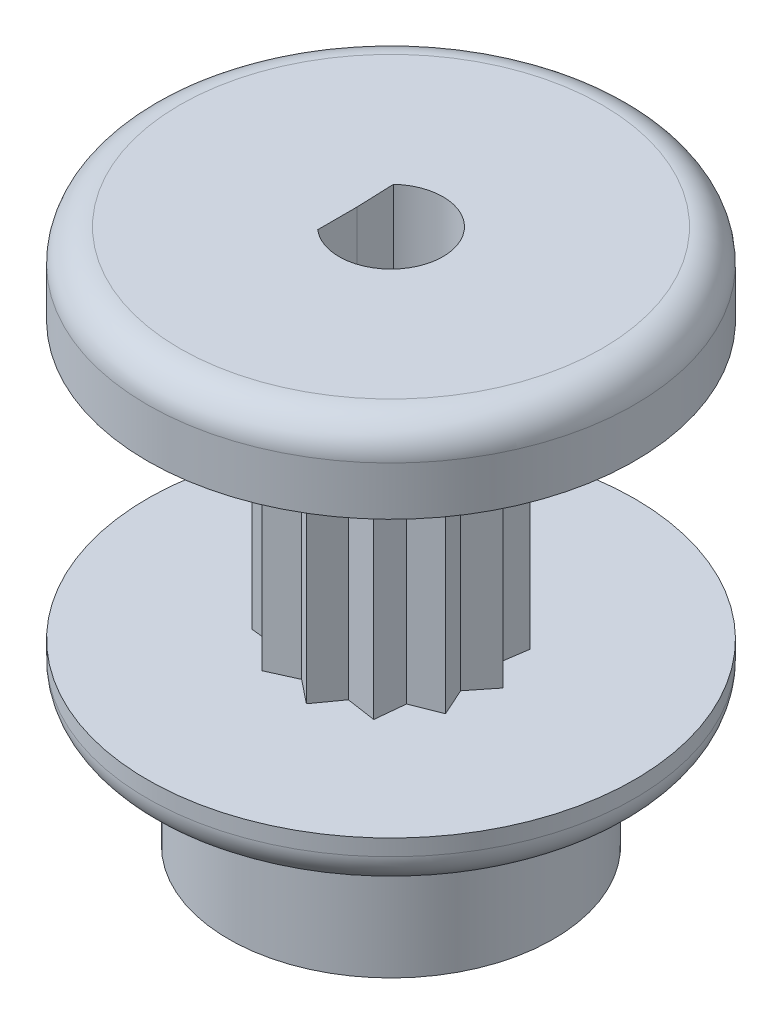
ISO-10303-21;
HEADER;
FILE_DESCRIPTION(('STEP AP214'),'2;1');
FILE_NAME('part.step','',(''),(''),'','','');
FILE_SCHEMA(('AUTOMOTIVE_DESIGN { 1 0 10303 214 1 1 1 1 }'));
ENDSEC;
DATA;
#1=APPLICATION_CONTEXT('core data for automotive mechanical design processes');
#2=APPLICATION_PROTOCOL_DEFINITION('international standard','automotive_design',2000,#1);
#3=PRODUCT_CONTEXT('',#1,'mechanical');
#4=PRODUCT('Part','Part','',(#3));
#5=PRODUCT_RELATED_PRODUCT_CATEGORY('part','',(#4));
#6=PRODUCT_DEFINITION_FORMATION('','',#4);
#7=PRODUCT_DEFINITION_CONTEXT('part definition',#1,'design');
#8=PRODUCT_DEFINITION('design','',#6,#7);
#9=PRODUCT_DEFINITION_SHAPE('','',#8);
#10=(LENGTH_UNIT() NAMED_UNIT(*) SI_UNIT(.MILLI.,.METRE.));
#11=(NAMED_UNIT(*) PLANE_ANGLE_UNIT() SI_UNIT($,.RADIAN.));
#12=(NAMED_UNIT(*) SI_UNIT($,.STERADIAN.) SOLID_ANGLE_UNIT());
#13=UNCERTAINTY_MEASURE_WITH_UNIT(LENGTH_MEASURE(1.E-05),#10,'distance_accuracy_value','');
#14=(GEOMETRIC_REPRESENTATION_CONTEXT(3) GLOBAL_UNCERTAINTY_ASSIGNED_CONTEXT((#13)) GLOBAL_UNIT_ASSIGNED_CONTEXT((#10,
#11,#12)) REPRESENTATION_CONTEXT('',''));
#15=CARTESIAN_POINT('',(0.,0.,0.));
#16=DIRECTION('',(0.,0.,1.));
#17=DIRECTION('',(1.,0.,0.));
#18=AXIS2_PLACEMENT_3D('',#15,#16,#17);
#19=CARTESIAN_POINT('',(2.40897724298439,8.5,-1.87597459427595));
#20=DIRECTION('',(-0.98910508226612,0.,-0.147211196025749));
#21=DIRECTION('',(-0.147211196025749,0.,0.98910508226612));
#22=AXIS2_PLACEMENT_3D('',#19,#20,#21);
#23=PLANE('',#22);
#24=DIRECTION('',(0.147211196025749,0.,-0.98910508226612));
#25=VECTOR('',#24,1.);
#26=CARTESIAN_POINT('',(2.40897724298439,0.,-1.87597459427595));
#27=LINE('',#26,#25);
#28=CARTESIAN_POINT('',(2.27272108525414,0.,-0.960475897577142));
#29=VERTEX_POINT('',#28);
#30=CARTESIAN_POINT('',(2.40897724298439,0.,-1.87597459427595));
#31=VERTEX_POINT('',#30);
#32=EDGE_CURVE('E259',#29,#31,#27,.T.);
#33=ORIENTED_EDGE('',*,*,#32,.T.);
#34=DIRECTION('',(0.,-1.,0.));
#35=VECTOR('',#34,1.);
#36=CARTESIAN_POINT('',(2.40897724298439,8.5,-1.87597459427595));
#37=LINE('',#36,#35);
#38=CARTESIAN_POINT('',(2.40897724298439,8.5,-1.87597459427595));
#39=VERTEX_POINT('',#38);
#40=EDGE_CURVE('E253',#39,#31,#37,.T.);
#41=ORIENTED_EDGE('',*,*,#40,.F.);
#42=DIRECTION('',(0.147211196025749,0.,-0.98910508226612));
#43=VECTOR('',#42,1.);
#44=CARTESIAN_POINT('',(2.40897724298439,8.5,-1.87597459427595));
#45=LINE('',#44,#43);
#46=CARTESIAN_POINT('',(2.27272108525414,8.5,-0.960475897577142));
#47=VERTEX_POINT('',#46);
#48=EDGE_CURVE('E260',#47,#39,#45,.T.);
#49=ORIENTED_EDGE('',*,*,#48,.F.);
#50=DIRECTION('',(0.,-1.,0.));
#51=VECTOR('',#50,1.);
#52=CARTESIAN_POINT('',(2.27272108525414,8.5,-0.960475897577142));
#53=LINE('',#52,#51);
#54=EDGE_CURVE('E333',#47,#29,#53,.T.);
#55=ORIENTED_EDGE('',*,*,#54,.T.);
#56=EDGE_LOOP('',(#33,#41,#49,#55));
#57=FACE_BOUND('',#56,.T.);
#58=ADVANCED_FACE('F33',(#57),#23,.F.);
#59=CARTESIAN_POINT('',(2.40897724298439,8.5,-1.87597459427595));
#60=DIRECTION('',(-0.0995939756317187,0.,0.995028160414502));
#61=DIRECTION('',(0.995028160414502,0.,0.0995939756317187));
#62=AXIS2_PLACEMENT_3D('',#59,#60,#61);
#63=PLANE('',#62);
#64=DIRECTION('',(-0.995028160414502,0.,-0.0995939756317187));
#65=VECTOR('',#64,1.);
#66=CARTESIAN_POINT('',(2.40897724298439,0.,-1.87597459427595));
#67=LINE('',#66,#65);
#68=CARTESIAN_POINT('',(1.48799624675807,0.,-1.96815706965156));
#69=VERTEX_POINT('',#68);
#70=EDGE_CURVE('E336',#31,#69,#67,.T.);
#71=ORIENTED_EDGE('',*,*,#70,.T.);
#72=DIRECTION('',(0.,-1.,0.));
#73=VECTOR('',#72,1.);
#74=CARTESIAN_POINT('',(1.48799624675807,8.5,-1.96815706965156));
#75=LINE('',#74,#73);
#76=CARTESIAN_POINT('',(1.48799624675807,8.5,-1.96815706965156));
#77=VERTEX_POINT('',#76);
#78=EDGE_CURVE('E469',#77,#69,#75,.T.);
#79=ORIENTED_EDGE('',*,*,#78,.F.);
#80=DIRECTION('',(-0.995028160414502,0.,-0.0995939756317187));
#81=VECTOR('',#80,1.);
#82=CARTESIAN_POINT('',(2.40897724298439,8.5,-1.87597459427595));
#83=LINE('',#82,#81);
#84=EDGE_CURVE('E263',#39,#77,#83,.T.);
#85=ORIENTED_EDGE('',*,*,#84,.F.);
#86=ORIENTED_EDGE('',*,*,#40,.T.);
#87=EDGE_LOOP('',(#71,#79,#85,#86));
#88=FACE_BOUND('',#87,.T.);
#89=ADVANCED_FACE('F494',(#88),#63,.F.);
#90=CARTESIAN_POINT('',(1.14824819242517,8.5,-2.82913027698939));
#91=DIRECTION('',(-0.930195726267649,0.,0.367063905653228));
#92=DIRECTION('',(0.367063905653228,0.,0.930195726267649));
#93=AXIS2_PLACEMENT_3D('',#90,#91,#92);
#94=PLANE('',#93);
#95=DIRECTION('',(-0.367063905653228,0.,-0.930195726267649));
#96=VECTOR('',#95,1.);
#97=CARTESIAN_POINT('',(1.14824819242517,0.,-2.82913027698939));
#98=LINE('',#97,#96);
#99=CARTESIAN_POINT('',(1.14824819242517,0.,-2.82913027698939));
#100=VERTEX_POINT('',#99);
#101=EDGE_CURVE('E339',#69,#100,#98,.T.);
#102=ORIENTED_EDGE('',*,*,#101,.T.);
#103=DIRECTION('',(0.,-1.,0.));
#104=VECTOR('',#103,1.);
#105=CARTESIAN_POINT('',(1.14824819242517,8.5,-2.82913027698939));
#106=LINE('',#105,#104);
#107=CARTESIAN_POINT('',(1.14824819242517,8.5,-2.82913027698939));
#108=VERTEX_POINT('',#107);
#109=EDGE_CURVE('E466',#108,#100,#106,.T.);
#110=ORIENTED_EDGE('',*,*,#109,.F.);
#111=DIRECTION('',(-0.367063905653228,0.,-0.930195726267649));
#112=VECTOR('',#111,1.);
#113=CARTESIAN_POINT('',(1.14824819242517,8.5,-2.82913027698939));
#114=LINE('',#113,#112);
#115=EDGE_CURVE('E267',#77,#108,#114,.T.);
#116=ORIENTED_EDGE('',*,*,#115,.F.);
#117=ORIENTED_EDGE('',*,*,#78,.T.);
#118=EDGE_LOOP('',(#102,#110,#116,#117));
#119=FACE_BOUND('',#118,.T.);
#120=ADVANCED_FACE('F500',(#119),#94,.F.);
#121=CARTESIAN_POINT('',(1.14824819242517,8.5,-2.82913027698939));
#122=DIRECTION('',(0.411263167246308,0.,0.91151665221571));
#123=DIRECTION('',(0.91151665221571,0.,-0.411263167246308));
#124=AXIS2_PLACEMENT_3D('',#121,#122,#123);
#125=PLANE('',#124);
#126=DIRECTION('',(-0.91151665221571,0.,0.411263167246308));
#127=VECTOR('',#126,1.);
#128=CARTESIAN_POINT('',(1.14824819242517,0.,-2.82913027698939));
#129=LINE('',#128,#127);
#130=CARTESIAN_POINT('',(0.304564015602649,0.,-2.44847214433521));
#131=VERTEX_POINT('',#130);
#132=EDGE_CURVE('E342',#100,#131,#129,.T.);
#133=ORIENTED_EDGE('',*,*,#132,.T.);
#134=DIRECTION('',(0.,-1.,0.));
#135=VECTOR('',#134,1.);
#136=CARTESIAN_POINT('',(0.304564015602649,8.5,-2.44847214433521));
#137=LINE('',#136,#135);
#138=CARTESIAN_POINT('',(0.304564015602649,8.5,-2.44847214433521));
#139=VERTEX_POINT('',#138);
#140=EDGE_CURVE('E463',#139,#131,#137,.T.);
#141=ORIENTED_EDGE('',*,*,#140,.F.);
#142=DIRECTION('',(-0.91151665221571,0.,0.411263167246308));
#143=VECTOR('',#142,1.);
#144=CARTESIAN_POINT('',(1.14824819242517,8.5,-2.82913027698939));
#145=LINE('',#144,#143);
#146=EDGE_CURVE('E270',#108,#139,#145,.T.);
#147=ORIENTED_EDGE('',*,*,#146,.F.);
#148=ORIENTED_EDGE('',*,*,#109,.T.);
#149=EDGE_LOOP('',(#133,#141,#147,#148));
#150=FACE_BOUND('',#149,.T.);
#151=ADVANCED_FACE('F506',(#150),#125,.F.);
#152=CARTESIAN_POINT('',(-0.420153034004953,8.5,-3.02422278670106));
#153=DIRECTION('',(-0.622041176612838,0.,0.782984530241892));
#154=DIRECTION('',(0.782984530241892,0.,0.622041176612838));
#155=AXIS2_PLACEMENT_3D('',#152,#153,#154);
#156=PLANE('',#155);
#157=DIRECTION('',(-0.782984530241892,0.,-0.622041176612838));
#158=VECTOR('',#157,1.);
#159=CARTESIAN_POINT('',(-0.420153034004953,0.,-3.02422278670106));
#160=LINE('',#159,#158);
#161=CARTESIAN_POINT('',(-0.420153034004953,0.,-3.02422278670106));
#162=VERTEX_POINT('',#161);
#163=EDGE_CURVE('E345',#131,#162,#160,.T.);
#164=ORIENTED_EDGE('',*,*,#163,.T.);
#165=DIRECTION('',(0.,-1.,0.));
#166=VECTOR('',#165,1.);
#167=CARTESIAN_POINT('',(-0.420153034004953,8.5,-3.02422278670106));
#168=LINE('',#167,#166);
#169=CARTESIAN_POINT('',(-0.420153034004953,8.5,-3.02422278670106));
#170=VERTEX_POINT('',#169);
#171=EDGE_CURVE('E460',#170,#162,#168,.T.);
#172=ORIENTED_EDGE('',*,*,#171,.F.);
#173=DIRECTION('',(-0.782984530241892,0.,-0.622041176612838));
#174=VECTOR('',#173,1.);
#175=CARTESIAN_POINT('',(-0.420153034004953,8.5,-3.02422278670106));
#176=LINE('',#175,#174);
#177=EDGE_CURVE('E273',#139,#170,#176,.T.);
#178=ORIENTED_EDGE('',*,*,#177,.F.);
#179=ORIENTED_EDGE('',*,*,#140,.T.);
#180=EDGE_LOOP('',(#164,#172,#178,#179));
#181=FACE_BOUND('',#180,.T.);
#182=ADVANCED_FACE('F510',(#181),#156,.F.);
#183=CARTESIAN_POINT('',(-0.420153034004953,8.5,-3.02422278670106));
#184=DIRECTION('',(0.811922676584047,0.,0.583764993168138));
#185=DIRECTION('',(0.583764993168138,0.,-0.811922676584047));
#186=AXIS2_PLACEMENT_3D('',#183,#184,#185);
#187=PLANE('',#186);
#188=DIRECTION('',(-0.583764993168138,0.,0.811922676584047));
#189=VECTOR('',#188,1.);
#190=CARTESIAN_POINT('',(-0.420153034004953,0.,-3.02422278670106));
#191=LINE('',#190,#189);
#192=CARTESIAN_POINT('',(-0.960475897577033,0.,-2.27272108525415));
#193=VERTEX_POINT('',#192);
#194=EDGE_CURVE('E348',#162,#193,#191,.T.);
#195=ORIENTED_EDGE('',*,*,#194,.T.);
#196=DIRECTION('',(0.,-1.,0.));
#197=VECTOR('',#196,1.);
#198=CARTESIAN_POINT('',(-0.960475897577033,8.5,-2.27272108525415));
#199=LINE('',#198,#197);
#200=CARTESIAN_POINT('',(-0.960475897577033,8.5,-2.27272108525415));
#201=VERTEX_POINT('',#200);
#202=EDGE_CURVE('E457',#201,#193,#199,.T.);
#203=ORIENTED_EDGE('',*,*,#202,.F.);
#204=DIRECTION('',(-0.583764993168138,0.,0.811922676584047));
#205=VECTOR('',#204,1.);
#206=CARTESIAN_POINT('',(-0.420153034004953,8.5,-3.02422278670106));
#207=LINE('',#206,#205);
#208=EDGE_CURVE('E276',#170,#201,#207,.T.);
#209=ORIENTED_EDGE('',*,*,#208,.F.);
#210=ORIENTED_EDGE('',*,*,#171,.T.);
#211=EDGE_LOOP('',(#195,#203,#209,#210));
#212=FACE_BOUND('',#211,.T.);
#213=ADVANCED_FACE('F514',(#212),#187,.F.);
#214=CARTESIAN_POINT('',(-1.87597459427584,8.5,-2.4089772429844));
#215=DIRECTION('',(-0.147211196025749,0.,0.98910508226612));
#216=DIRECTION('',(0.98910508226612,0.,0.147211196025749));
#217=AXIS2_PLACEMENT_3D('',#214,#215,#216);
#218=PLANE('',#217);
#219=DIRECTION('',(-0.98910508226612,0.,-0.147211196025749));
#220=VECTOR('',#219,1.);
#221=CARTESIAN_POINT('',(-1.87597459427584,0.,-2.4089772429844));
#222=LINE('',#221,#220);
#223=CARTESIAN_POINT('',(-1.87597459427584,0.,-2.4089772429844));
#224=VERTEX_POINT('',#223);
#225=EDGE_CURVE('E351',#193,#224,#222,.T.);
#226=ORIENTED_EDGE('',*,*,#225,.T.);
#227=DIRECTION('',(0.,-1.,0.));
#228=VECTOR('',#227,1.);
#229=CARTESIAN_POINT('',(-1.87597459427584,8.5,-2.4089772429844));
#230=LINE('',#229,#228);
#231=CARTESIAN_POINT('',(-1.87597459427584,8.5,-2.4089772429844));
#232=VERTEX_POINT('',#231);
#233=EDGE_CURVE('E454',#232,#224,#230,.T.);
#234=ORIENTED_EDGE('',*,*,#233,.F.);
#235=DIRECTION('',(-0.98910508226612,0.,-0.147211196025749));
#236=VECTOR('',#235,1.);
#237=CARTESIAN_POINT('',(-1.87597459427584,8.5,-2.4089772429844));
#238=LINE('',#237,#236);
#239=EDGE_CURVE('E279',#201,#232,#238,.T.);
#240=ORIENTED_EDGE('',*,*,#239,.F.);
#241=ORIENTED_EDGE('',*,*,#202,.T.);
#242=EDGE_LOOP('',(#226,#234,#240,#241));
#243=FACE_BOUND('',#242,.T.);
#244=ADVANCED_FACE('F518',(#243),#218,.F.);
#245=CARTESIAN_POINT('',(-1.87597459427584,8.5,-2.4089772429844));
#246=DIRECTION('',(0.995028160414506,0.,0.0995939756316801));
#247=DIRECTION('',(0.0995939756316801,0.,-0.995028160414506));
#248=AXIS2_PLACEMENT_3D('',#245,#246,#247);
#249=PLANE('',#248);
#250=DIRECTION('',(-0.0995939756316801,0.,0.995028160414506));
#251=VECTOR('',#250,1.);
#252=CARTESIAN_POINT('',(-1.87597459427584,0.,-2.4089772429844));
#253=LINE('',#252,#251);
#254=CARTESIAN_POINT('',(-1.96815706965141,0.,-1.4879962467581));
#255=VERTEX_POINT('',#254);
#256=EDGE_CURVE('E354',#224,#255,#253,.T.);
#257=ORIENTED_EDGE('',*,*,#256,.T.);
#258=DIRECTION('',(0.,-1.,0.));
#259=VECTOR('',#258,1.);
#260=CARTESIAN_POINT('',(-1.96815706965141,8.5,-1.4879962467581));
#261=LINE('',#260,#259);
#262=CARTESIAN_POINT('',(-1.96815706965141,8.5,-1.4879962467581));
#263=VERTEX_POINT('',#262);
#264=EDGE_CURVE('E451',#263,#255,#261,.T.);
#265=ORIENTED_EDGE('',*,*,#264,.F.);
#266=DIRECTION('',(-0.0995939756316801,0.,0.995028160414506));
#267=VECTOR('',#266,1.);
#268=CARTESIAN_POINT('',(-1.87597459427584,8.5,-2.4089772429844));
#269=LINE('',#268,#267);
#270=EDGE_CURVE('E282',#232,#263,#269,.T.);
#271=ORIENTED_EDGE('',*,*,#270,.F.);
#272=ORIENTED_EDGE('',*,*,#233,.T.);
#273=EDGE_LOOP('',(#257,#265,#271,#272));
#274=FACE_BOUND('',#273,.T.);
#275=ADVANCED_FACE('F522',(#274),#249,.F.);
#276=CARTESIAN_POINT('',(-2.82913027698925,8.5,-1.14824819242515));
#277=DIRECTION('',(0.367063905653272,0.,0.930195726267631));
#278=DIRECTION('',(0.930195726267631,0.,-0.367063905653272));
#279=AXIS2_PLACEMENT_3D('',#276,#277,#278);
#280=PLANE('',#279);
#281=DIRECTION('',(-0.930195726267631,0.,0.367063905653272));
#282=VECTOR('',#281,1.);
#283=CARTESIAN_POINT('',(-2.82913027698925,0.,-1.14824819242515));
#284=LINE('',#283,#282);
#285=CARTESIAN_POINT('',(-2.82913027698925,0.,-1.14824819242515));
#286=VERTEX_POINT('',#285);
#287=EDGE_CURVE('E357',#255,#286,#284,.T.);
#288=ORIENTED_EDGE('',*,*,#287,.T.);
#289=DIRECTION('',(0.,-1.,0.));
#290=VECTOR('',#289,1.);
#291=CARTESIAN_POINT('',(-2.82913027698925,8.5,-1.14824819242515));
#292=LINE('',#291,#290);
#293=CARTESIAN_POINT('',(-2.82913027698925,8.5,-1.14824819242515));
#294=VERTEX_POINT('',#293);
#295=EDGE_CURVE('E448',#294,#286,#292,.T.);
#296=ORIENTED_EDGE('',*,*,#295,.F.);
#297=DIRECTION('',(-0.930195726267631,0.,0.367063905653272));
#298=VECTOR('',#297,1.);
#299=CARTESIAN_POINT('',(-2.82913027698925,8.5,-1.14824819242515));
#300=LINE('',#299,#298);
#301=EDGE_CURVE('E285',#263,#294,#300,.T.);
#302=ORIENTED_EDGE('',*,*,#301,.F.);
#303=ORIENTED_EDGE('',*,*,#264,.T.);
#304=EDGE_LOOP('',(#288,#296,#302,#303));
#305=FACE_BOUND('',#304,.T.);
#306=ADVANCED_FACE('F526',(#305),#280,.F.);
#307=CARTESIAN_POINT('',(-2.82913027698925,8.5,-1.14824819242515));
#308=DIRECTION('',(0.911516652215699,0.,-0.411263167246331));
#309=DIRECTION('',(-0.411263167246331,0.,-0.911516652215699));
#310=AXIS2_PLACEMENT_3D('',#307,#308,#309);
#311=PLANE('',#310);
#312=DIRECTION('',(0.411263167246331,0.,0.911516652215699));
#313=VECTOR('',#312,1.);
#314=CARTESIAN_POINT('',(-2.82913027698925,0.,-1.14824819242515));
#315=LINE('',#314,#313);
#316=CARTESIAN_POINT('',(-2.44847214433507,0.,-0.304564015602695));
#317=VERTEX_POINT('',#316);
#318=EDGE_CURVE('E360',#286,#317,#315,.T.);
#319=ORIENTED_EDGE('',*,*,#318,.T.);
#320=DIRECTION('',(0.,-1.,0.));
#321=VECTOR('',#320,1.);
#322=CARTESIAN_POINT('',(-2.44847214433507,8.5,-0.304564015602695));
#323=LINE('',#322,#321);
#324=CARTESIAN_POINT('',(-2.44847214433507,8.5,-0.304564015602695));
#325=VERTEX_POINT('',#324);
#326=EDGE_CURVE('E445',#325,#317,#323,.T.);
#327=ORIENTED_EDGE('',*,*,#326,.F.);
#328=DIRECTION('',(0.411263167246331,0.,0.911516652215699));
#329=VECTOR('',#328,1.);
#330=CARTESIAN_POINT('',(-2.82913027698925,8.5,-1.14824819242515));
#331=LINE('',#330,#329);
#332=EDGE_CURVE('E288',#294,#325,#331,.T.);
#333=ORIENTED_EDGE('',*,*,#332,.F.);
#334=ORIENTED_EDGE('',*,*,#295,.T.);
#335=EDGE_LOOP('',(#319,#327,#333,#334));
#336=FACE_BOUND('',#335,.T.);
#337=ADVANCED_FACE('F530',(#336),#311,.F.);
#338=CARTESIAN_POINT('',(-3.02422278670094,8.5,0.420153034004897));
#339=DIRECTION('',(0.782984530241884,0.,0.622041176612848));
#340=DIRECTION('',(0.622041176612848,0.,-0.782984530241884));
#341=AXIS2_PLACEMENT_3D('',#338,#339,#340);
#342=PLANE('',#341);
#343=DIRECTION('',(-0.622041176612848,0.,0.782984530241884));
#344=VECTOR('',#343,1.);
#345=CARTESIAN_POINT('',(-3.02422278670094,0.,0.420153034004897));
#346=LINE('',#345,#344);
#347=CARTESIAN_POINT('',(-3.02422278670094,0.,0.420153034004897));
#348=VERTEX_POINT('',#347);
#349=EDGE_CURVE('E363',#317,#348,#346,.T.);
#350=ORIENTED_EDGE('',*,*,#349,.T.);
#351=DIRECTION('',(0.,-1.,0.));
#352=VECTOR('',#351,1.);
#353=CARTESIAN_POINT('',(-3.02422278670094,8.5,0.420153034004897));
#354=LINE('',#353,#352);
#355=CARTESIAN_POINT('',(-3.02422278670094,8.5,0.420153034004897));
#356=VERTEX_POINT('',#355);
#357=EDGE_CURVE('E442',#356,#348,#354,.T.);
#358=ORIENTED_EDGE('',*,*,#357,.F.);
#359=DIRECTION('',(-0.622041176612848,0.,0.782984530241884));
#360=VECTOR('',#359,1.);
#361=CARTESIAN_POINT('',(-3.02422278670094,8.5,0.420153034004897));
#362=LINE('',#361,#360);
#363=EDGE_CURVE('E291',#325,#356,#362,.T.);
#364=ORIENTED_EDGE('',*,*,#363,.F.);
#365=ORIENTED_EDGE('',*,*,#326,.T.);
#366=EDGE_LOOP('',(#350,#358,#364,#365));
#367=FACE_BOUND('',#366,.T.);
#368=ADVANCED_FACE('F534',(#367),#342,.F.);
#369=CARTESIAN_POINT('',(-3.02422278670094,8.5,0.420153034004897));
#370=DIRECTION('',(0.583764993168176,0.,-0.811922676584021));
#371=DIRECTION('',(-0.811922676584021,0.,-0.583764993168176));
#372=AXIS2_PLACEMENT_3D('',#369,#370,#371);
#373=PLANE('',#372);
#374=DIRECTION('',(0.811922676584021,0.,0.583764993168176));
#375=VECTOR('',#374,1.);
#376=CARTESIAN_POINT('',(-3.02422278670094,0.,0.420153034004897));
#377=LINE('',#376,#375);
#378=CARTESIAN_POINT('',(-2.27272108525404,0.,0.960475897577017));
#379=VERTEX_POINT('',#378);
#380=EDGE_CURVE('E366',#348,#379,#377,.T.);
#381=ORIENTED_EDGE('',*,*,#380,.T.);
#382=DIRECTION('',(0.,-1.,0.));
#383=VECTOR('',#382,1.);
#384=CARTESIAN_POINT('',(-2.27272108525404,8.5,0.960475897577017));
#385=LINE('',#384,#383);
#386=CARTESIAN_POINT('',(-2.27272108525404,8.5,0.960475897577017));
#387=VERTEX_POINT('',#386);
#388=EDGE_CURVE('E439',#387,#379,#385,.T.);
#389=ORIENTED_EDGE('',*,*,#388,.F.);
#390=DIRECTION('',(0.811922676584021,0.,0.583764993168176));
#391=VECTOR('',#390,1.);
#392=CARTESIAN_POINT('',(-3.02422278670094,8.5,0.420153034004897));
#393=LINE('',#392,#391);
#394=EDGE_CURVE('E294',#356,#387,#393,.T.);
#395=ORIENTED_EDGE('',*,*,#394,.F.);
#396=ORIENTED_EDGE('',*,*,#357,.T.);
#397=EDGE_LOOP('',(#381,#389,#395,#396));
#398=FACE_BOUND('',#397,.T.);
#399=ADVANCED_FACE('F538',(#398),#373,.F.);
#400=CARTESIAN_POINT('',(-2.40897724298429,8.5,1.87597459427583));
#401=DIRECTION('',(0.98910508226612,0.,0.147211196025748));
#402=DIRECTION('',(0.147211196025748,0.,-0.98910508226612));
#403=AXIS2_PLACEMENT_3D('',#400,#401,#402);
#404=PLANE('',#403);
#405=DIRECTION('',(-0.147211196025748,0.,0.98910508226612));
#406=VECTOR('',#405,1.);
#407=CARTESIAN_POINT('',(-2.40897724298429,0.,1.87597459427583));
#408=LINE('',#407,#406);
#409=CARTESIAN_POINT('',(-2.40897724298429,0.,1.87597459427583));
#410=VERTEX_POINT('',#409);
#411=EDGE_CURVE('E369',#379,#410,#408,.T.);
#412=ORIENTED_EDGE('',*,*,#411,.T.);
#413=DIRECTION('',(0.,-1.,0.));
#414=VECTOR('',#413,1.);
#415=CARTESIAN_POINT('',(-2.40897724298429,8.5,1.87597459427583));
#416=LINE('',#415,#414);
#417=CARTESIAN_POINT('',(-2.40897724298429,8.5,1.87597459427583));
#418=VERTEX_POINT('',#417);
#419=EDGE_CURVE('E436',#418,#410,#416,.T.);
#420=ORIENTED_EDGE('',*,*,#419,.F.);
#421=DIRECTION('',(-0.147211196025748,0.,0.98910508226612));
#422=VECTOR('',#421,1.);
#423=CARTESIAN_POINT('',(-2.40897724298429,8.5,1.87597459427583));
#424=LINE('',#423,#422);
#425=EDGE_CURVE('E297',#387,#418,#424,.T.);
#426=ORIENTED_EDGE('',*,*,#425,.F.);
#427=ORIENTED_EDGE('',*,*,#388,.T.);
#428=EDGE_LOOP('',(#412,#420,#426,#427));
#429=FACE_BOUND('',#428,.T.);
#430=ADVANCED_FACE('F542',(#429),#404,.F.);
#431=CARTESIAN_POINT('',(-2.40897724298429,8.5,1.87597459427583));
#432=DIRECTION('',(0.099593975631679,0.,-0.995028160414506));
#433=DIRECTION('',(-0.995028160414506,0.,-0.099593975631679));
#434=AXIS2_PLACEMENT_3D('',#431,#432,#433);
#435=PLANE('',#434);
#436=DIRECTION('',(0.995028160414506,0.,0.099593975631679));
#437=VECTOR('',#436,1.);
#438=CARTESIAN_POINT('',(-2.40897724298429,0.,1.87597459427583));
#439=LINE('',#438,#437);
#440=CARTESIAN_POINT('',(-1.48799624675799,0.,1.96815706965139));
#441=VERTEX_POINT('',#440);
#442=EDGE_CURVE('E372',#410,#441,#439,.T.);
#443=ORIENTED_EDGE('',*,*,#442,.T.);
#444=DIRECTION('',(0.,-1.,0.));
#445=VECTOR('',#444,1.);
#446=CARTESIAN_POINT('',(-1.48799624675799,8.5,1.96815706965139));
#447=LINE('',#446,#445);
#448=CARTESIAN_POINT('',(-1.48799624675799,8.5,1.96815706965139));
#449=VERTEX_POINT('',#448);
#450=EDGE_CURVE('E433',#449,#441,#447,.T.);
#451=ORIENTED_EDGE('',*,*,#450,.F.);
#452=DIRECTION('',(0.995028160414506,0.,0.099593975631679));
#453=VECTOR('',#452,1.);
#454=CARTESIAN_POINT('',(-2.40897724298429,8.5,1.87597459427583));
#455=LINE('',#454,#453);
#456=EDGE_CURVE('E300',#418,#449,#455,.T.);
#457=ORIENTED_EDGE('',*,*,#456,.F.);
#458=ORIENTED_EDGE('',*,*,#419,.T.);
#459=EDGE_LOOP('',(#443,#451,#457,#458));
#460=FACE_BOUND('',#459,.T.);
#461=ADVANCED_FACE('F546',(#460),#435,.F.);
#462=CARTESIAN_POINT('',(-1.14824819242504,8.5,2.82913027698924));
#463=DIRECTION('',(0.930195726267631,0.,-0.367063905653272));
#464=DIRECTION('',(-0.367063905653272,0.,-0.930195726267631));
#465=AXIS2_PLACEMENT_3D('',#462,#463,#464);
#466=PLANE('',#465);
#467=DIRECTION('',(0.367063905653272,0.,0.930195726267631));
#468=VECTOR('',#467,1.);
#469=CARTESIAN_POINT('',(-1.14824819242504,0.,2.82913027698924));
#470=LINE('',#469,#468);
#471=CARTESIAN_POINT('',(-1.14824819242504,0.,2.82913027698924));
#472=VERTEX_POINT('',#471);
#473=EDGE_CURVE('E375',#441,#472,#470,.T.);
#474=ORIENTED_EDGE('',*,*,#473,.T.);
#475=DIRECTION('',(0.,-1.,0.));
#476=VECTOR('',#475,1.);
#477=CARTESIAN_POINT('',(-1.14824819242504,8.5,2.82913027698924));
#478=LINE('',#477,#476);
#479=CARTESIAN_POINT('',(-1.14824819242504,8.5,2.82913027698924));
#480=VERTEX_POINT('',#479);
#481=EDGE_CURVE('E430',#480,#472,#478,.T.);
#482=ORIENTED_EDGE('',*,*,#481,.F.);
#483=DIRECTION('',(0.367063905653272,0.,0.930195726267631));
#484=VECTOR('',#483,1.);
#485=CARTESIAN_POINT('',(-1.14824819242504,8.5,2.82913027698924));
#486=LINE('',#485,#484);
#487=EDGE_CURVE('E303',#449,#480,#486,.T.);
#488=ORIENTED_EDGE('',*,*,#487,.F.);
#489=ORIENTED_EDGE('',*,*,#450,.T.);
#490=EDGE_LOOP('',(#474,#482,#488,#489));
#491=FACE_BOUND('',#490,.T.);
#492=ADVANCED_FACE('F550',(#491),#466,.F.);
#493=CARTESIAN_POINT('',(-1.14824819242504,8.5,2.82913027698924));
#494=DIRECTION('',(-0.411263167246331,0.,-0.911516652215699));
#495=DIRECTION('',(-0.911516652215699,0.,0.411263167246331));
#496=AXIS2_PLACEMENT_3D('',#493,#494,#495);
#497=PLANE('',#496);
#498=DIRECTION('',(0.911516652215699,0.,-0.411263167246331));
#499=VECTOR('',#498,1.);
#500=CARTESIAN_POINT('',(-1.14824819242504,0.,2.82913027698924));
#501=LINE('',#500,#499);
#502=CARTESIAN_POINT('',(-0.304564015602584,0.,2.44847214433506));
#503=VERTEX_POINT('',#502);
#504=EDGE_CURVE('E378',#472,#503,#501,.T.);
#505=ORIENTED_EDGE('',*,*,#504,.T.);
#506=DIRECTION('',(0.,-1.,0.));
#507=VECTOR('',#506,1.);
#508=CARTESIAN_POINT('',(-0.304564015602584,8.5,2.44847214433506));
#509=LINE('',#508,#507);
#510=CARTESIAN_POINT('',(-0.304564015602584,8.5,2.44847214433506));
#511=VERTEX_POINT('',#510);
#512=EDGE_CURVE('E427',#511,#503,#509,.T.);
#513=ORIENTED_EDGE('',*,*,#512,.F.);
#514=DIRECTION('',(0.911516652215699,0.,-0.411263167246331));
#515=VECTOR('',#514,1.);
#516=CARTESIAN_POINT('',(-1.14824819242504,8.5,2.82913027698924));
#517=LINE('',#516,#515);
#518=EDGE_CURVE('E306',#480,#511,#517,.T.);
#519=ORIENTED_EDGE('',*,*,#518,.F.);
#520=ORIENTED_EDGE('',*,*,#481,.T.);
#521=EDGE_LOOP('',(#505,#513,#519,#520));
#522=FACE_BOUND('',#521,.T.);
#523=ADVANCED_FACE('F554',(#522),#497,.F.);
#524=CARTESIAN_POINT('',(0.420153034005007,8.5,3.02422278670092));
#525=DIRECTION('',(0.622041176612848,0.,-0.782984530241884));
#526=DIRECTION('',(-0.782984530241884,0.,-0.622041176612848));
#527=AXIS2_PLACEMENT_3D('',#524,#525,#526);
#528=PLANE('',#527);
#529=DIRECTION('',(0.782984530241884,0.,0.622041176612848));
#530=VECTOR('',#529,1.);
#531=CARTESIAN_POINT('',(0.420153034005007,0.,3.02422278670092));
#532=LINE('',#531,#530);
#533=CARTESIAN_POINT('',(0.420153034005007,0.,3.02422278670092));
#534=VERTEX_POINT('',#533);
#535=EDGE_CURVE('E381',#503,#534,#532,.T.);
#536=ORIENTED_EDGE('',*,*,#535,.T.);
#537=DIRECTION('',(0.,-1.,0.));
#538=VECTOR('',#537,1.);
#539=CARTESIAN_POINT('',(0.420153034005007,8.5,3.02422278670092));
#540=LINE('',#539,#538);
#541=CARTESIAN_POINT('',(0.420153034005007,8.5,3.02422278670092));
#542=VERTEX_POINT('',#541);
#543=EDGE_CURVE('E424',#542,#534,#540,.T.);
#544=ORIENTED_EDGE('',*,*,#543,.F.);
#545=DIRECTION('',(0.782984530241884,0.,0.622041176612848));
#546=VECTOR('',#545,1.);
#547=CARTESIAN_POINT('',(0.420153034005007,8.5,3.02422278670092));
#548=LINE('',#547,#546);
#549=EDGE_CURVE('E309',#511,#542,#548,.T.);
#550=ORIENTED_EDGE('',*,*,#549,.F.);
#551=ORIENTED_EDGE('',*,*,#512,.T.);
#552=EDGE_LOOP('',(#536,#544,#550,#551));
#553=FACE_BOUND('',#552,.T.);
#554=ADVANCED_FACE('F558',(#553),#528,.F.);
#555=CARTESIAN_POINT('',(0.420153034005007,8.5,3.02422278670092));
#556=DIRECTION('',(-0.811922676584021,0.,-0.583764993168176));
#557=DIRECTION('',(-0.583764993168176,0.,0.811922676584021));
#558=AXIS2_PLACEMENT_3D('',#555,#556,#557);
#559=PLANE('',#558);
#560=DIRECTION('',(0.583764993168176,0.,-0.811922676584021));
#561=VECTOR('',#560,1.);
#562=CARTESIAN_POINT('',(0.420153034005007,0.,3.02422278670092));
#563=LINE('',#562,#561);
#564=CARTESIAN_POINT('',(0.960475897577128,0.,2.27272108525403));
#565=VERTEX_POINT('',#564);
#566=EDGE_CURVE('E384',#534,#565,#563,.T.);
#567=ORIENTED_EDGE('',*,*,#566,.T.);
#568=DIRECTION('',(0.,-1.,0.));
#569=VECTOR('',#568,1.);
#570=CARTESIAN_POINT('',(0.960475897577128,8.5,2.27272108525403));
#571=LINE('',#570,#569);
#572=CARTESIAN_POINT('',(0.960475897577128,8.5,2.27272108525403));
#573=VERTEX_POINT('',#572);
#574=EDGE_CURVE('E421',#573,#565,#571,.T.);
#575=ORIENTED_EDGE('',*,*,#574,.F.);
#576=DIRECTION('',(0.583764993168176,0.,-0.811922676584021));
#577=VECTOR('',#576,1.);
#578=CARTESIAN_POINT('',(0.420153034005007,8.5,3.02422278670092));
#579=LINE('',#578,#577);
#580=EDGE_CURVE('E312',#542,#573,#579,.T.);
#581=ORIENTED_EDGE('',*,*,#580,.F.);
#582=ORIENTED_EDGE('',*,*,#543,.T.);
#583=EDGE_LOOP('',(#567,#575,#581,#582));
#584=FACE_BOUND('',#583,.T.);
#585=ADVANCED_FACE('F562',(#584),#559,.F.);
#586=CARTESIAN_POINT('',(1.87597459427594,8.5,2.40897724298428));
#587=DIRECTION('',(0.147211196025748,0.,-0.98910508226612));
#588=DIRECTION('',(-0.98910508226612,0.,-0.147211196025748));
#589=AXIS2_PLACEMENT_3D('',#586,#587,#588);
#590=PLANE('',#589);
#591=DIRECTION('',(0.98910508226612,0.,0.147211196025748));
#592=VECTOR('',#591,1.);
#593=CARTESIAN_POINT('',(1.87597459427594,0.,2.40897724298428));
#594=LINE('',#593,#592);
#595=CARTESIAN_POINT('',(1.87597459427594,0.,2.40897724298428));
#596=VERTEX_POINT('',#595);
#597=EDGE_CURVE('E387',#565,#596,#594,.T.);
#598=ORIENTED_EDGE('',*,*,#597,.T.);
#599=DIRECTION('',(0.,-1.,0.));
#600=VECTOR('',#599,1.);
#601=CARTESIAN_POINT('',(1.87597459427594,8.5,2.40897724298428));
#602=LINE('',#601,#600);
#603=CARTESIAN_POINT('',(1.87597459427594,8.5,2.40897724298428));
#604=VERTEX_POINT('',#603);
#605=EDGE_CURVE('E418',#604,#596,#602,.T.);
#606=ORIENTED_EDGE('',*,*,#605,.F.);
#607=DIRECTION('',(0.98910508226612,0.,0.147211196025748));
#608=VECTOR('',#607,1.);
#609=CARTESIAN_POINT('',(1.87597459427594,8.5,2.40897724298428));
#610=LINE('',#609,#608);
#611=EDGE_CURVE('E315',#573,#604,#610,.T.);
#612=ORIENTED_EDGE('',*,*,#611,.F.);
#613=ORIENTED_EDGE('',*,*,#574,.T.);
#614=EDGE_LOOP('',(#598,#606,#612,#613));
#615=FACE_BOUND('',#614,.T.);
#616=ADVANCED_FACE('F566',(#615),#590,.F.);
#617=CARTESIAN_POINT('',(1.87597459427594,8.5,2.40897724298428));
#618=DIRECTION('',(-0.995028160414502,0.,-0.0995939756317176));
#619=DIRECTION('',(-0.0995939756317176,0.,0.995028160414502));
#620=AXIS2_PLACEMENT_3D('',#617,#618,#619);
#621=PLANE('',#620);
#622=DIRECTION('',(0.0995939756317176,0.,-0.995028160414502));
#623=VECTOR('',#622,1.);
#624=CARTESIAN_POINT('',(1.87597459427594,0.,2.40897724298428));
#625=LINE('',#624,#623);
#626=CARTESIAN_POINT('',(1.96815706965154,0.,1.48799624675796));
#627=VERTEX_POINT('',#626);
#628=EDGE_CURVE('E390',#596,#627,#625,.T.);
#629=ORIENTED_EDGE('',*,*,#628,.T.);
#630=DIRECTION('',(0.,-1.,0.));
#631=VECTOR('',#630,1.);
#632=CARTESIAN_POINT('',(1.96815706965154,8.5,1.48799624675796));
#633=LINE('',#632,#631);
#634=CARTESIAN_POINT('',(1.96815706965154,8.5,1.48799624675796));
#635=VERTEX_POINT('',#634);
#636=EDGE_CURVE('E415',#635,#627,#633,.T.);
#637=ORIENTED_EDGE('',*,*,#636,.F.);
#638=DIRECTION('',(0.0995939756317176,0.,-0.995028160414502));
#639=VECTOR('',#638,1.);
#640=CARTESIAN_POINT('',(1.87597459427594,8.5,2.40897724298428));
#641=LINE('',#640,#639);
#642=EDGE_CURVE('E318',#604,#635,#641,.T.);
#643=ORIENTED_EDGE('',*,*,#642,.F.);
#644=ORIENTED_EDGE('',*,*,#605,.T.);
#645=EDGE_LOOP('',(#629,#637,#643,#644));
#646=FACE_BOUND('',#645,.T.);
#647=ADVANCED_FACE('F570',(#646),#621,.F.);
#648=CARTESIAN_POINT('',(2.82913027698935,8.5,1.14824819242503));
#649=DIRECTION('',(-0.367063905653271,0.,-0.930195726267632));
#650=DIRECTION('',(-0.930195726267631,0.,0.367063905653271));
#651=AXIS2_PLACEMENT_3D('',#648,#649,#650);
#652=PLANE('',#651);
#653=DIRECTION('',(0.930195726267631,0.,-0.367063905653271));
#654=VECTOR('',#653,1.);
#655=CARTESIAN_POINT('',(2.82913027698935,0.,1.14824819242503));
#656=LINE('',#655,#654);
#657=CARTESIAN_POINT('',(2.82913027698935,0.,1.14824819242503));
#658=VERTEX_POINT('',#657);
#659=EDGE_CURVE('E393',#627,#658,#656,.T.);
#660=ORIENTED_EDGE('',*,*,#659,.T.);
#661=DIRECTION('',(0.,-1.,0.));
#662=VECTOR('',#661,1.);
#663=CARTESIAN_POINT('',(2.82913027698935,8.5,1.14824819242503));
#664=LINE('',#663,#662);
#665=CARTESIAN_POINT('',(2.82913027698935,8.5,1.14824819242503));
#666=VERTEX_POINT('',#665);
#667=EDGE_CURVE('E412',#666,#658,#664,.T.);
#668=ORIENTED_EDGE('',*,*,#667,.F.);
#669=DIRECTION('',(0.930195726267631,0.,-0.367063905653271));
#670=VECTOR('',#669,1.);
#671=CARTESIAN_POINT('',(2.82913027698935,8.5,1.14824819242503));
#672=LINE('',#671,#670);
#673=EDGE_CURVE('E321',#635,#666,#672,.T.);
#674=ORIENTED_EDGE('',*,*,#673,.F.);
#675=ORIENTED_EDGE('',*,*,#636,.T.);
#676=EDGE_LOOP('',(#660,#668,#674,#675));
#677=FACE_BOUND('',#676,.T.);
#678=ADVANCED_FACE('F574',(#677),#652,.F.);
#679=CARTESIAN_POINT('',(2.82913027698935,8.5,1.14824819242503));
#680=DIRECTION('',(-0.911516652215716,0.,0.411263167246294));
#681=DIRECTION('',(0.411263167246294,0.,0.911516652215716));
#682=AXIS2_PLACEMENT_3D('',#679,#680,#681);
#683=PLANE('',#682);
#684=DIRECTION('',(-0.411263167246294,0.,-0.911516652215716));
#685=VECTOR('',#684,1.);
#686=CARTESIAN_POINT('',(2.82913027698935,0.,1.14824819242503));
#687=LINE('',#686,#685);
#688=CARTESIAN_POINT('',(2.44847214433519,0.,0.304564015602539));
#689=VERTEX_POINT('',#688);
#690=EDGE_CURVE('E396',#658,#689,#687,.T.);
#691=ORIENTED_EDGE('',*,*,#690,.T.);
#692=DIRECTION('',(0.,-1.,0.));
#693=VECTOR('',#692,1.);
#694=CARTESIAN_POINT('',(2.44847214433519,8.5,0.304564015602539));
#695=LINE('',#694,#693);
#696=CARTESIAN_POINT('',(2.44847214433519,8.5,0.304564015602539));
#697=VERTEX_POINT('',#696);
#698=EDGE_CURVE('E409',#697,#689,#695,.T.);
#699=ORIENTED_EDGE('',*,*,#698,.F.);
#700=DIRECTION('',(-0.411263167246294,0.,-0.911516652215716));
#701=VECTOR('',#700,1.);
#702=CARTESIAN_POINT('',(2.82913027698935,8.5,1.14824819242503));
#703=LINE('',#702,#701);
#704=EDGE_CURVE('E324',#666,#697,#703,.T.);
#705=ORIENTED_EDGE('',*,*,#704,.F.);
#706=ORIENTED_EDGE('',*,*,#667,.T.);
#707=EDGE_LOOP('',(#691,#699,#705,#706));
#708=FACE_BOUND('',#707,.T.);
#709=ADVANCED_FACE('F578',(#708),#683,.F.);
#710=CARTESIAN_POINT('',(3.02422278670106,8.5,-0.420153034004984));
#711=DIRECTION('',(-0.782984530241854,0.,-0.622041176612885));
#712=DIRECTION('',(-0.622041176612885,0.,0.782984530241854));
#713=AXIS2_PLACEMENT_3D('',#710,#711,#712);
#714=PLANE('',#713);
#715=DIRECTION('',(0.622041176612885,0.,-0.782984530241854));
#716=VECTOR('',#715,1.);
#717=CARTESIAN_POINT('',(3.02422278670106,0.,-0.420153034004984));
#718=LINE('',#717,#716);
#719=CARTESIAN_POINT('',(3.02422278670106,0.,-0.420153034004984));
#720=VERTEX_POINT('',#719);
#721=EDGE_CURVE('E399',#689,#720,#718,.T.);
#722=ORIENTED_EDGE('',*,*,#721,.T.);
#723=DIRECTION('',(0.,-1.,0.));
#724=VECTOR('',#723,1.);
#725=CARTESIAN_POINT('',(3.02422278670106,8.5,-0.420153034004984));
#726=LINE('',#725,#724);
#727=CARTESIAN_POINT('',(3.02422278670106,8.5,-0.420153034004984));
#728=VERTEX_POINT('',#727);
#729=EDGE_CURVE('E406',#728,#720,#726,.T.);
#730=ORIENTED_EDGE('',*,*,#729,.F.);
#731=DIRECTION('',(0.622041176612885,0.,-0.782984530241854));
#732=VECTOR('',#731,1.);
#733=CARTESIAN_POINT('',(3.02422278670106,8.5,-0.420153034004984));
#734=LINE('',#733,#732);
#735=EDGE_CURVE('E327',#697,#728,#734,.T.);
#736=ORIENTED_EDGE('',*,*,#735,.F.);
#737=ORIENTED_EDGE('',*,*,#698,.T.);
#738=EDGE_LOOP('',(#722,#730,#736,#737));
#739=FACE_BOUND('',#738,.T.);
#740=ADVANCED_FACE('F582',(#739),#714,.F.);
#741=CARTESIAN_POINT('',(3.02422278670106,8.5,-0.420153034004984));
#742=DIRECTION('',(-0.583764993168189,0.,0.811922676584011));
#743=DIRECTION('',(0.811922676584011,0.,0.583764993168189));
#744=AXIS2_PLACEMENT_3D('',#741,#742,#743);
#745=PLANE('',#744);
#746=DIRECTION('',(-0.811922676584011,0.,-0.583764993168189));
#747=VECTOR('',#746,1.);
#748=CARTESIAN_POINT('',(3.02422278670106,0.,-0.420153034004984));
#749=LINE('',#748,#747);
#750=EDGE_CURVE('E264',#720,#29,#749,.T.);
#751=ORIENTED_EDGE('',*,*,#750,.T.);
#752=ORIENTED_EDGE('',*,*,#54,.F.);
#753=DIRECTION('',(-0.811922676584011,0.,-0.583764993168189));
#754=VECTOR('',#753,1.);
#755=CARTESIAN_POINT('',(3.02422278670106,8.5,-0.420153034004984));
#756=LINE('',#755,#754);
#757=EDGE_CURVE('E330',#728,#47,#756,.T.);
#758=ORIENTED_EDGE('',*,*,#757,.F.);
#759=ORIENTED_EDGE('',*,*,#729,.T.);
#760=EDGE_LOOP('',(#751,#752,#758,#759));
#761=FACE_BOUND('',#760,.T.);
#762=ADVANCED_FACE('F586',(#761),#745,.F.);
#763=CARTESIAN_POINT('',(0.,8.5,0.));
#764=DIRECTION('',(0.,1.,0.));
#765=DIRECTION('',(0.,0.,1.));
#766=AXIS2_PLACEMENT_3D('',#763,#764,#765);
#767=PLANE('',#766);
#768=CARTESIAN_POINT('',(0.,8.5,0.));
#769=DIRECTION('',(0.,1.,0.));
#770=DIRECTION('',(0.,0.,1.));
#771=AXIS2_PLACEMENT_3D('',#768,#769,#770);
#772=CIRCLE('',#771,7.5);
#773=CARTESIAN_POINT('',(0.,8.5,7.5));
#774=VERTEX_POINT('',#773);
#775=EDGE_CURVE('E256',#774,#774,#772,.T.);
#776=ORIENTED_EDGE('',*,*,#775,.F.);
#777=EDGE_LOOP('',(#776));
#778=FACE_BOUND('',#777,.T.);
#779=ORIENTED_EDGE('',*,*,#757,.T.);
#780=ORIENTED_EDGE('',*,*,#48,.T.);
#781=ORIENTED_EDGE('',*,*,#84,.T.);
#782=ORIENTED_EDGE('',*,*,#115,.T.);
#783=ORIENTED_EDGE('',*,*,#146,.T.);
#784=ORIENTED_EDGE('',*,*,#177,.T.);
#785=ORIENTED_EDGE('',*,*,#208,.T.);
#786=ORIENTED_EDGE('',*,*,#239,.T.);
#787=ORIENTED_EDGE('',*,*,#270,.T.);
#788=ORIENTED_EDGE('',*,*,#301,.T.);
#789=ORIENTED_EDGE('',*,*,#332,.T.);
#790=ORIENTED_EDGE('',*,*,#363,.T.);
#791=ORIENTED_EDGE('',*,*,#394,.T.);
#792=ORIENTED_EDGE('',*,*,#425,.T.);
#793=ORIENTED_EDGE('',*,*,#456,.T.);
#794=ORIENTED_EDGE('',*,*,#487,.T.);
#795=ORIENTED_EDGE('',*,*,#518,.T.);
#796=ORIENTED_EDGE('',*,*,#549,.T.);
#797=ORIENTED_EDGE('',*,*,#580,.T.);
#798=ORIENTED_EDGE('',*,*,#611,.T.);
#799=ORIENTED_EDGE('',*,*,#642,.T.);
#800=ORIENTED_EDGE('',*,*,#673,.T.);
#801=ORIENTED_EDGE('',*,*,#704,.T.);
#802=ORIENTED_EDGE('',*,*,#735,.T.);
#803=EDGE_LOOP('',(#779,#780,#781,#782,#783,#784,#785,#786,#787,#788,#789,#790,#791,#792,#793,
#794,#795,#796,#797,#798,#799,#800,#801,#802));
#804=FACE_BOUND('',#803,.T.);
#805=ADVANCED_FACE('F590',(#778,#804),#767,.F.);
#806=CARTESIAN_POINT('',(0.,11.,0.));
#807=DIRECTION('',(0.,-1.,0.));
#808=DIRECTION('',(0.,0.,-1.));
#809=AXIS2_PLACEMENT_3D('',#806,#807,#808);
#810=CYLINDRICAL_SURFACE('',#809,7.5);
#811=CARTESIAN_POINT('',(0.,10.,0.));
#812=DIRECTION('',(0.,1.,0.));
#813=DIRECTION('',(0.,0.,1.));
#814=AXIS2_PLACEMENT_3D('',#811,#812,#813);
#815=CIRCLE('',#814,7.5);
#816=CARTESIAN_POINT('',(0.,10.,7.5));
#817=VERTEX_POINT('',#816);
#818=EDGE_CURVE('E11',#817,#817,#815,.F.);
#819=ORIENTED_EDGE('',*,*,#818,.T.);
#820=EDGE_LOOP('',(#819));
#821=FACE_BOUND('',#820,.T.);
#822=ORIENTED_EDGE('',*,*,#775,.T.);
#823=EDGE_LOOP('',(#822));
#824=FACE_BOUND('',#823,.T.);
#825=ADVANCED_FACE('F592',(#821,#824),#810,.T.);
#826=CARTESIAN_POINT('',(0.,11.,0.));
#827=DIRECTION('',(0.,1.,0.));
#828=DIRECTION('',(0.,0.,1.));
#829=AXIS2_PLACEMENT_3D('',#826,#827,#828);
#830=PLANE('',#829);
#831=DIRECTION('',(0.,0.,-1.));
#832=VECTOR('',#831,1.);
#833=CARTESIAN_POINT('',(-1.04827586206896,11.,0.));
#834=LINE('',#833,#832);
#835=CARTESIAN_POINT('',(-1.04827586206896,11.,1.20876702345968));
#836=VERTEX_POINT('',#835);
#837=CARTESIAN_POINT('',(-1.04827586206896,11.,0.));
#838=VERTEX_POINT('',#837);
#839=EDGE_CURVE('E216',#836,#838,#834,.T.);
#840=ORIENTED_EDGE('',*,*,#839,.T.);
#841=DIRECTION('',(-0.0377504348603706,0.,-0.999287198290788));
#842=VECTOR('',#841,1.);
#843=CARTESIAN_POINT('',(-1.04827586206896,11.,0.));
#844=LINE('',#843,#842);
#845=CARTESIAN_POINT('',(-1.09243789695541,11.,-1.16900788761053));
#846=VERTEX_POINT('',#845);
#847=EDGE_CURVE('E222',#838,#846,#844,.T.);
#848=ORIENTED_EDGE('',*,*,#847,.T.);
#849=CARTESIAN_POINT('',(0.,11.,0.));
#850=DIRECTION('',(0.,-1.,0.));
#851=DIRECTION('',(0.,0.,-1.));
#852=AXIS2_PLACEMENT_3D('',#849,#850,#851);
#853=CIRCLE('',#852,1.6);
#854=EDGE_CURVE('E55',#846,#836,#853,.T.);
#855=ORIENTED_EDGE('',*,*,#854,.T.);
#856=EDGE_LOOP('',(#840,#848,#855));
#857=FACE_BOUND('',#856,.T.);
#858=CARTESIAN_POINT('',(0.,11.,0.));
#859=DIRECTION('',(0.,1.,0.));
#860=DIRECTION('',(0.,0.,1.));
#861=AXIS2_PLACEMENT_3D('',#858,#859,#860);
#862=CIRCLE('',#861,6.5);
#863=CARTESIAN_POINT('',(0.,11.,6.5));
#864=VERTEX_POINT('',#863);
#865=EDGE_CURVE('E41',#864,#864,#862,.T.);
#866=ORIENTED_EDGE('',*,*,#865,.T.);
#867=EDGE_LOOP('',(#866));
#868=FACE_BOUND('',#867,.T.);
#869=ADVANCED_FACE('F226',(#857,#868),#830,.T.);
#870=CARTESIAN_POINT('',(0.,-1.5,0.));
#871=DIRECTION('',(0.,1.,0.));
#872=DIRECTION('',(0.,0.,1.));
#873=AXIS2_PLACEMENT_3D('',#870,#871,#872);
#874=CYLINDRICAL_SURFACE('',#873,7.5);
#875=CARTESIAN_POINT('',(0.,-0.5,0.));
#876=DIRECTION('',(0.,-1.,0.));
#877=DIRECTION('',(0.,0.,-1.));
#878=AXIS2_PLACEMENT_3D('',#875,#876,#877);
#879=CIRCLE('',#878,7.5);
#880=CARTESIAN_POINT('',(0.,-0.5,-7.5));
#881=VERTEX_POINT('',#880);
#882=EDGE_CURVE('E476',#881,#881,#879,.F.);
#883=ORIENTED_EDGE('',*,*,#882,.T.);
#884=EDGE_LOOP('',(#883));
#885=FACE_BOUND('',#884,.T.);
#886=CARTESIAN_POINT('',(0.,0.,0.));
#887=DIRECTION('',(0.,-1.,0.));
#888=DIRECTION('',(0.,0.,-1.));
#889=AXIS2_PLACEMENT_3D('',#886,#887,#888);
#890=CIRCLE('',#889,7.5);
#891=CARTESIAN_POINT('',(0.,0.,-7.5));
#892=VERTEX_POINT('',#891);
#893=EDGE_CURVE('E248',#892,#892,#890,.T.);
#894=ORIENTED_EDGE('',*,*,#893,.T.);
#895=EDGE_LOOP('',(#894));
#896=FACE_BOUND('',#895,.T.);
#897=ADVANCED_FACE('F601',(#885,#896),#874,.T.);
#898=CARTESIAN_POINT('',(0.,-1.5,0.));
#899=DIRECTION('',(0.,-1.,0.));
#900=DIRECTION('',(0.,0.,-1.));
#901=AXIS2_PLACEMENT_3D('',#898,#899,#900);
#902=PLANE('',#901);
#903=CARTESIAN_POINT('',(0.,-1.5,0.));
#904=DIRECTION('',(0.,-1.,0.));
#905=DIRECTION('',(0.,0.,-1.));
#906=AXIS2_PLACEMENT_3D('',#903,#904,#905);
#907=CIRCLE('',#906,6.5);
#908=CARTESIAN_POINT('',(0.,-1.5,-6.5));
#909=VERTEX_POINT('',#908);
#910=EDGE_CURVE('E252',#909,#909,#907,.T.);
#911=ORIENTED_EDGE('',*,*,#910,.T.);
#912=EDGE_LOOP('',(#911));
#913=FACE_BOUND('',#912,.T.);
#914=CARTESIAN_POINT('',(0.,-1.5,0.));
#915=DIRECTION('',(0.,-1.,0.));
#916=DIRECTION('',(0.,0.,-1.));
#917=AXIS2_PLACEMENT_3D('',#914,#915,#916);
#918=CIRCLE('',#917,5.);
#919=CARTESIAN_POINT('',(0.,-1.5,-5.));
#920=VERTEX_POINT('',#919);
#921=EDGE_CURVE('E249',#920,#920,#918,.T.);
#922=ORIENTED_EDGE('',*,*,#921,.F.);
#923=EDGE_LOOP('',(#922));
#924=FACE_BOUND('',#923,.T.);
#925=ADVANCED_FACE('F604',(#913,#924),#902,.T.);
#926=CARTESIAN_POINT('',(0.,0.,0.));
#927=DIRECTION('',(0.,-1.,0.));
#928=DIRECTION('',(0.,0.,-1.));
#929=AXIS2_PLACEMENT_3D('',#926,#927,#928);
#930=PLANE('',#929);
#931=ORIENTED_EDGE('',*,*,#32,.F.);
#932=ORIENTED_EDGE('',*,*,#750,.F.);
#933=ORIENTED_EDGE('',*,*,#721,.F.);
#934=ORIENTED_EDGE('',*,*,#690,.F.);
#935=ORIENTED_EDGE('',*,*,#659,.F.);
#936=ORIENTED_EDGE('',*,*,#628,.F.);
#937=ORIENTED_EDGE('',*,*,#597,.F.);
#938=ORIENTED_EDGE('',*,*,#566,.F.);
#939=ORIENTED_EDGE('',*,*,#535,.F.);
#940=ORIENTED_EDGE('',*,*,#504,.F.);
#941=ORIENTED_EDGE('',*,*,#473,.F.);
#942=ORIENTED_EDGE('',*,*,#442,.F.);
#943=ORIENTED_EDGE('',*,*,#411,.F.);
#944=ORIENTED_EDGE('',*,*,#380,.F.);
#945=ORIENTED_EDGE('',*,*,#349,.F.);
#946=ORIENTED_EDGE('',*,*,#318,.F.);
#947=ORIENTED_EDGE('',*,*,#287,.F.);
#948=ORIENTED_EDGE('',*,*,#256,.F.);
#949=ORIENTED_EDGE('',*,*,#225,.F.);
#950=ORIENTED_EDGE('',*,*,#194,.F.);
#951=ORIENTED_EDGE('',*,*,#163,.F.);
#952=ORIENTED_EDGE('',*,*,#132,.F.);
#953=ORIENTED_EDGE('',*,*,#101,.F.);
#954=ORIENTED_EDGE('',*,*,#70,.F.);
#955=EDGE_LOOP('',(#931,#932,#933,#934,#935,#936,#937,#938,#939,#940,#941,#942,#943,#944,#945,
#946,#947,#948,#949,#950,#951,#952,#953,#954));
#956=FACE_BOUND('',#955,.T.);
#957=ORIENTED_EDGE('',*,*,#893,.F.);
#958=EDGE_LOOP('',(#957));
#959=FACE_BOUND('',#958,.T.);
#960=ADVANCED_FACE('F606',(#956,#959),#930,.F.);
#961=CARTESIAN_POINT('',(0.,-5.5,0.));
#962=DIRECTION('',(0.,1.,0.));
#963=DIRECTION('',(0.,0.,1.));
#964=AXIS2_PLACEMENT_3D('',#961,#962,#963);
#965=CYLINDRICAL_SURFACE('',#964,5.);
#966=CARTESIAN_POINT('',(0.,-5.5,0.));
#967=DIRECTION('',(0.,-1.,0.));
#968=DIRECTION('',(0.,0.,-1.));
#969=AXIS2_PLACEMENT_3D('',#966,#967,#968);
#970=CIRCLE('',#969,5.);
#971=CARTESIAN_POINT('',(0.,-5.5,-5.));
#972=VERTEX_POINT('',#971);
#973=EDGE_CURVE('E243',#972,#972,#970,.T.);
#974=ORIENTED_EDGE('',*,*,#973,.F.);
#975=EDGE_LOOP('',(#974));
#976=FACE_BOUND('',#975,.T.);
#977=ORIENTED_EDGE('',*,*,#921,.T.);
#978=EDGE_LOOP('',(#977));
#979=FACE_BOUND('',#978,.T.);
#980=ADVANCED_FACE('F609',(#976,#979),#965,.T.);
#981=CARTESIAN_POINT('',(0.,-5.5,0.));
#982=DIRECTION('',(0.,-1.,0.));
#983=DIRECTION('',(0.,0.,-1.));
#984=AXIS2_PLACEMENT_3D('',#981,#982,#983);
#985=PLANE('',#984);
#986=CARTESIAN_POINT('',(0.,-5.5,0.));
#987=DIRECTION('',(0.,-1.,0.));
#988=DIRECTION('',(0.,0.,-1.));
#989=AXIS2_PLACEMENT_3D('',#986,#987,#988);
#990=CIRCLE('',#989,3.);
#991=CARTESIAN_POINT('',(0.,-5.5,-3.));
#992=VERTEX_POINT('',#991);
#993=EDGE_CURVE('E238',#992,#992,#990,.T.);
#994=ORIENTED_EDGE('',*,*,#993,.F.);
#995=EDGE_LOOP('',(#994));
#996=FACE_BOUND('',#995,.T.);
#997=ORIENTED_EDGE('',*,*,#973,.T.);
#998=EDGE_LOOP('',(#997));
#999=FACE_BOUND('',#998,.T.);
#1000=ADVANCED_FACE('F616',(#996,#999),#985,.T.);
#1001=CARTESIAN_POINT('',(0.,-5.4,0.));
#1002=DIRECTION('',(0.,-1.,0.));
#1003=DIRECTION('',(0.,0.,-1.));
#1004=AXIS2_PLACEMENT_3D('',#1001,#1002,#1003);
#1005=CYLINDRICAL_SURFACE('',#1004,3.);
#1006=CARTESIAN_POINT('',(0.,-5.4,0.));
#1007=DIRECTION('',(0.,-1.,0.));
#1008=DIRECTION('',(0.,0.,-1.));
#1009=AXIS2_PLACEMENT_3D('',#1006,#1007,#1008);
#1010=CIRCLE('',#1009,3.);
#1011=CARTESIAN_POINT('',(0.,-5.4,-3.));
#1012=VERTEX_POINT('',#1011);
#1013=EDGE_CURVE('E240',#1012,#1012,#1010,.T.);
#1014=ORIENTED_EDGE('',*,*,#1013,.F.);
#1015=EDGE_LOOP('',(#1014));
#1016=FACE_BOUND('',#1015,.T.);
#1017=ORIENTED_EDGE('',*,*,#993,.T.);
#1018=EDGE_LOOP('',(#1017));
#1019=FACE_BOUND('',#1018,.T.);
#1020=ADVANCED_FACE('F620',(#1016,#1019),#1005,.F.);
#1021=CARTESIAN_POINT('',(0.,-5.4,0.));
#1022=DIRECTION('',(0.,-1.,0.));
#1023=DIRECTION('',(0.,0.,-1.));
#1024=AXIS2_PLACEMENT_3D('',#1021,#1022,#1023);
#1025=PLANE('',#1024);
#1026=DIRECTION('',(0.,0.,-1.));
#1027=VECTOR('',#1026,1.);
#1028=CARTESIAN_POINT('',(-1.04827586206896,-5.4,0.));
#1029=LINE('',#1028,#1027);
#1030=CARTESIAN_POINT('',(-1.04827586206896,-5.4,1.20876702345968));
#1031=VERTEX_POINT('',#1030);
#1032=CARTESIAN_POINT('',(-1.04827586206896,-5.4,0.));
#1033=VERTEX_POINT('',#1032);
#1034=EDGE_CURVE('E218',#1031,#1033,#1029,.T.);
#1035=ORIENTED_EDGE('',*,*,#1034,.F.);
#1036=CARTESIAN_POINT('',(0.,-5.4,0.));
#1037=DIRECTION('',(0.,-1.,0.));
#1038=DIRECTION('',(0.,0.,-1.));
#1039=AXIS2_PLACEMENT_3D('',#1036,#1037,#1038);
#1040=CIRCLE('',#1039,1.6);
#1041=CARTESIAN_POINT('',(-1.09243789695541,-5.4,-1.16900788761053));
#1042=VERTEX_POINT('',#1041);
#1043=EDGE_CURVE('E228',#1042,#1031,#1040,.T.);
#1044=ORIENTED_EDGE('',*,*,#1043,.F.);
#1045=DIRECTION('',(-0.0377504348603706,0.,-0.999287198290788));
#1046=VECTOR('',#1045,1.);
#1047=CARTESIAN_POINT('',(-1.04827586206896,-5.4,0.));
#1048=LINE('',#1047,#1046);
#1049=EDGE_CURVE('E48',#1033,#1042,#1048,.T.);
#1050=ORIENTED_EDGE('',*,*,#1049,.F.);
#1051=EDGE_LOOP('',(#1035,#1044,#1050));
#1052=FACE_BOUND('',#1051,.T.);
#1053=ORIENTED_EDGE('',*,*,#1013,.T.);
#1054=EDGE_LOOP('',(#1053));
#1055=FACE_BOUND('',#1054,.T.);
#1056=ADVANCED_FACE('F490',(#1052,#1055),#1025,.T.);
#1057=CARTESIAN_POINT('',(0.,-0.5,0.));
#1058=DIRECTION('',(0.,-1.,0.));
#1059=DIRECTION('',(0.,0.,-1.));
#1060=AXIS2_PLACEMENT_3D('',#1057,#1058,#1059);
#1061=TOROIDAL_SURFACE('',#1060,6.5,1.);
#1062=ORIENTED_EDGE('',*,*,#882,.F.);
#1063=EDGE_LOOP('',(#1062));
#1064=FACE_BOUND('',#1063,.T.);
#1065=ORIENTED_EDGE('',*,*,#910,.F.);
#1066=EDGE_LOOP('',(#1065));
#1067=FACE_BOUND('',#1066,.T.);
#1068=ADVANCED_FACE('F482',(#1064,#1067),#1061,.T.);
#1069=CARTESIAN_POINT('',(0.,10.,0.));
#1070=DIRECTION('',(0.,1.,0.));
#1071=DIRECTION('',(0.,0.,1.));
#1072=AXIS2_PLACEMENT_3D('',#1069,#1070,#1071);
#1073=TOROIDAL_SURFACE('',#1072,6.5,1.);
#1074=ORIENTED_EDGE('',*,*,#818,.F.);
#1075=EDGE_LOOP('',(#1074));
#1076=FACE_BOUND('',#1075,.T.);
#1077=ORIENTED_EDGE('',*,*,#865,.F.);
#1078=EDGE_LOOP('',(#1077));
#1079=FACE_BOUND('',#1078,.T.);
#1080=ADVANCED_FACE('F35',(#1076,#1079),#1073,.T.);
#1081=CARTESIAN_POINT('',(-1.04827586206896,11.,0.));
#1082=DIRECTION('',(-1.,0.,0.));
#1083=DIRECTION('',(0.,0.,1.));
#1084=AXIS2_PLACEMENT_3D('',#1081,#1082,#1083);
#1085=PLANE('',#1084);
#1086=ORIENTED_EDGE('',*,*,#1034,.T.);
#1087=DIRECTION('',(0.,-1.,0.));
#1088=VECTOR('',#1087,1.);
#1089=CARTESIAN_POINT('',(-1.04827586206896,11.,0.));
#1090=LINE('',#1089,#1088);
#1091=EDGE_CURVE('E212',#838,#1033,#1090,.T.);
#1092=ORIENTED_EDGE('',*,*,#1091,.F.);
#1093=ORIENTED_EDGE('',*,*,#839,.F.);
#1094=DIRECTION('',(0.,-1.,0.));
#1095=VECTOR('',#1094,1.);
#1096=CARTESIAN_POINT('',(-1.04827586206896,11.,1.20876702345968));
#1097=LINE('',#1096,#1095);
#1098=EDGE_CURVE('E236',#836,#1031,#1097,.T.);
#1099=ORIENTED_EDGE('',*,*,#1098,.T.);
#1100=EDGE_LOOP('',(#1086,#1092,#1093,#1099));
#1101=FACE_BOUND('',#1100,.T.);
#1102=ADVANCED_FACE('F214',(#1101),#1085,.F.);
#1103=CARTESIAN_POINT('',(0.,11.,0.));
#1104=DIRECTION('',(0.,-1.,0.));
#1105=DIRECTION('',(0.,0.,-1.));
#1106=AXIS2_PLACEMENT_3D('',#1103,#1104,#1105);
#1107=CYLINDRICAL_SURFACE('',#1106,1.6);
#1108=ORIENTED_EDGE('',*,*,#1043,.T.);
#1109=ORIENTED_EDGE('',*,*,#1098,.F.);
#1110=ORIENTED_EDGE('',*,*,#854,.F.);
#1111=DIRECTION('',(0.,-1.,0.));
#1112=VECTOR('',#1111,1.);
#1113=CARTESIAN_POINT('',(-1.09243789695541,11.,-1.16900788761053));
#1114=LINE('',#1113,#1112);
#1115=EDGE_CURVE('E219',#846,#1042,#1114,.T.);
#1116=ORIENTED_EDGE('',*,*,#1115,.T.);
#1117=EDGE_LOOP('',(#1108,#1109,#1110,#1116));
#1118=FACE_BOUND('',#1117,.T.);
#1119=ADVANCED_FACE('F488',(#1118),#1107,.F.);
#1120=CARTESIAN_POINT('',(-1.04827586206896,11.,0.));
#1121=DIRECTION('',(-0.999287198290788,0.,0.0377504348603706));
#1122=DIRECTION('',(0.0377504348603706,0.,0.999287198290788));
#1123=AXIS2_PLACEMENT_3D('',#1120,#1121,#1122);
#1124=PLANE('',#1123);
#1125=ORIENTED_EDGE('',*,*,#1049,.T.);
#1126=ORIENTED_EDGE('',*,*,#1115,.F.);
#1127=ORIENTED_EDGE('',*,*,#847,.F.);
#1128=ORIENTED_EDGE('',*,*,#1091,.T.);
#1129=EDGE_LOOP('',(#1125,#1126,#1127,#1128));
#1130=FACE_BOUND('',#1129,.T.);
#1131=ADVANCED_FACE('F223',(#1130),#1124,.F.);
#1132=CLOSED_SHELL('',(#58,#89,#120,#151,#182,#213,#244,#275,#306,#337,#368,#399,#430,#461,#492,
#523,#554,#585,#616,#647,#678,#709,#740,#762,#805,#825,#869,#897,#925,#960,#980,#1000,#1020,
#1056,#1068,#1080,#1102,#1119,#1131));
#1133=MANIFOLD_SOLID_BREP('B2',#1132);
#1134=ADVANCED_BREP_SHAPE_REPRESENTATION('',(#18,#1133),#14);
#1135=SHAPE_DEFINITION_REPRESENTATION(#9,#1134);
ENDSEC;
END-ISO-10303-21;
